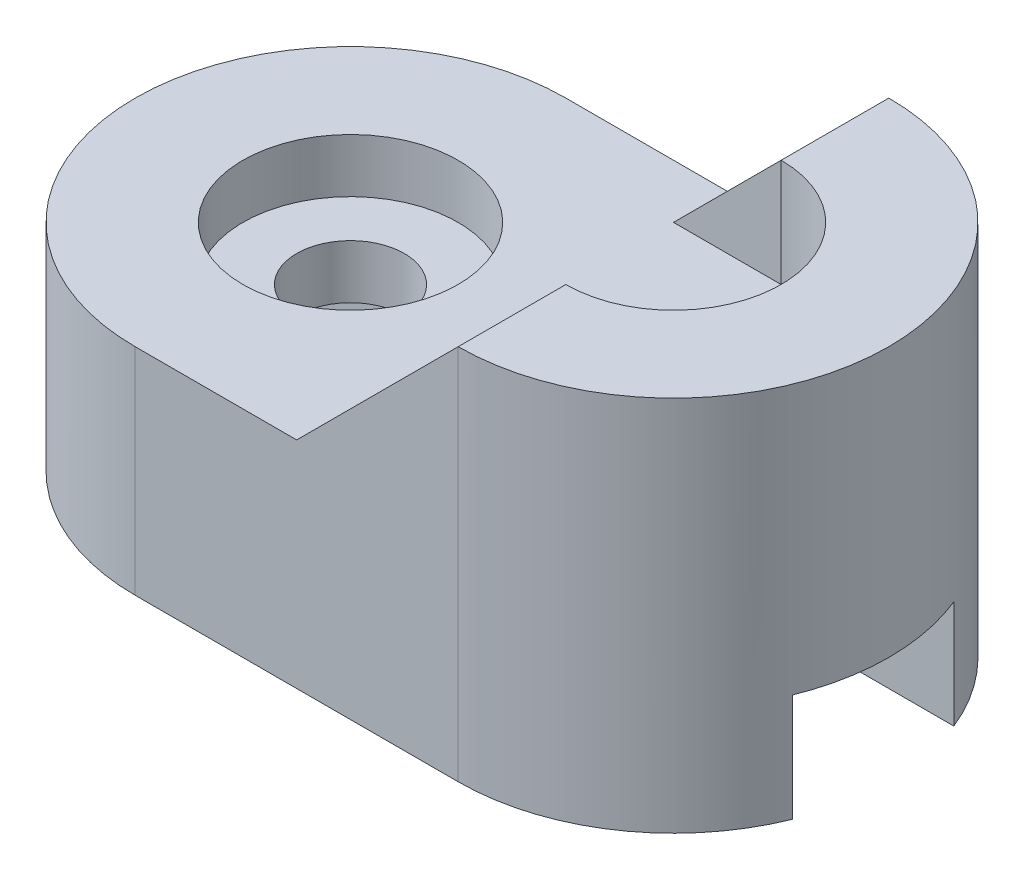
ISO-10303-21;
HEADER;
FILE_DESCRIPTION(('STEP AP214'),'2;1');
FILE_NAME('part.step','',(''),(''),'','','');
FILE_SCHEMA(('AUTOMOTIVE_DESIGN { 1 0 10303 214 1 1 1 1 }'));
ENDSEC;
DATA;
#1=APPLICATION_CONTEXT('core data for automotive mechanical design processes');
#2=APPLICATION_PROTOCOL_DEFINITION('international standard','automotive_design',2000,#1);
#3=PRODUCT_CONTEXT('',#1,'mechanical');
#4=PRODUCT('Part','Part','',(#3));
#5=PRODUCT_RELATED_PRODUCT_CATEGORY('part','',(#4));
#6=PRODUCT_DEFINITION_FORMATION('','',#4);
#7=PRODUCT_DEFINITION_CONTEXT('part definition',#1,'design');
#8=PRODUCT_DEFINITION('design','',#6,#7);
#9=PRODUCT_DEFINITION_SHAPE('','',#8);
#10=(LENGTH_UNIT() NAMED_UNIT(*) SI_UNIT(.MILLI.,.METRE.));
#11=(NAMED_UNIT(*) PLANE_ANGLE_UNIT() SI_UNIT($,.RADIAN.));
#12=(NAMED_UNIT(*) SI_UNIT($,.STERADIAN.) SOLID_ANGLE_UNIT());
#13=UNCERTAINTY_MEASURE_WITH_UNIT(LENGTH_MEASURE(1.E-05),#10,'distance_accuracy_value','');
#14=(GEOMETRIC_REPRESENTATION_CONTEXT(3) GLOBAL_UNCERTAINTY_ASSIGNED_CONTEXT((#13)) GLOBAL_UNIT_ASSIGNED_CONTEXT((#10,
#11,#12)) REPRESENTATION_CONTEXT('',''));
#15=CARTESIAN_POINT('',(0.,0.,0.));
#16=DIRECTION('',(0.,0.,1.));
#17=DIRECTION('',(1.,0.,0.));
#18=AXIS2_PLACEMENT_3D('',#15,#16,#17);
#19=CARTESIAN_POINT('',(0.,0.,0.));
#20=DIRECTION('',(0.,1.,0.));
#21=DIRECTION('',(0.,0.,1.));
#22=AXIS2_PLACEMENT_3D('',#19,#20,#21);
#23=PLANE('',#22);
#24=CARTESIAN_POINT('',(30.,0.,0.));
#25=DIRECTION('',(0.,1.,0.));
#26=DIRECTION('',(0.,0.,1.));
#27=AXIS2_PLACEMENT_3D('',#24,#25,#26);
#28=CIRCLE('',#27,40.);
#29=CARTESIAN_POINT('',(67.0809924354783,0.,-15.));
#30=VERTEX_POINT('',#29);
#31=CARTESIAN_POINT('',(30.,0.,-40.));
#32=VERTEX_POINT('',#31);
#33=EDGE_CURVE('E207',#30,#32,#28,.T.);
#34=ORIENTED_EDGE('',*,*,#33,.F.);
#35=DIRECTION('',(-1.,0.,0.));
#36=VECTOR('',#35,1.);
#37=CARTESIAN_POINT('',(0.,0.,-15.));
#38=LINE('',#37,#36);
#39=CARTESIAN_POINT('',(-67.0809924354783,0.,-15.));
#40=VERTEX_POINT('',#39);
#41=EDGE_CURVE('E56',#30,#40,#38,.T.);
#42=ORIENTED_EDGE('',*,*,#41,.T.);
#43=CARTESIAN_POINT('',(-30.,0.,0.));
#44=DIRECTION('',(0.,1.,0.));
#45=DIRECTION('',(0.,0.,1.));
#46=AXIS2_PLACEMENT_3D('',#43,#44,#45);
#47=CIRCLE('',#46,40.);
#48=CARTESIAN_POINT('',(-30.,0.,-40.));
#49=VERTEX_POINT('',#48);
#50=EDGE_CURVE('E196',#49,#40,#47,.T.);
#51=ORIENTED_EDGE('',*,*,#50,.F.);
#52=DIRECTION('',(1.,0.,0.));
#53=VECTOR('',#52,1.);
#54=CARTESIAN_POINT('',(0.,0.,-40.));
#55=LINE('',#54,#53);
#56=EDGE_CURVE('E212',#49,#32,#55,.T.);
#57=ORIENTED_EDGE('',*,*,#56,.T.);
#58=EDGE_LOOP('',(#34,#42,#51,#57));
#59=FACE_BOUND('',#58,.T.);
#60=ADVANCED_FACE('F47',(#59),#23,.F.);
#61=CARTESIAN_POINT('',(30.,70.,0.));
#62=DIRECTION('',(-1.,0.,0.));
#63=DIRECTION('',(0.,0.,1.));
#64=AXIS2_PLACEMENT_3D('',#61,#62,#63);
#65=PLANE('',#64);
#66=DIRECTION('',(0.,0.,1.));
#67=VECTOR('',#66,1.);
#68=CARTESIAN_POINT('',(30.,40.,0.));
#69=LINE('',#68,#67);
#70=CARTESIAN_POINT('',(30.,40.,20.));
#71=VERTEX_POINT('',#70);
#72=CARTESIAN_POINT('',(30.,40.,30.));
#73=VERTEX_POINT('',#72);
#74=EDGE_CURVE('E156',#71,#73,#69,.T.);
#75=ORIENTED_EDGE('',*,*,#74,.T.);
#76=DIRECTION('',(0.,1.,0.));
#77=VECTOR('',#76,1.);
#78=CARTESIAN_POINT('',(30.,70.,30.));
#79=LINE('',#78,#77);
#80=CARTESIAN_POINT('',(30.,70.,30.));
#81=VERTEX_POINT('',#80);
#82=EDGE_CURVE('E289',#73,#81,#79,.T.);
#83=ORIENTED_EDGE('',*,*,#82,.T.);
#84=DIRECTION('',(0.,0.,-1.));
#85=VECTOR('',#84,1.);
#86=CARTESIAN_POINT('',(30.,70.,0.));
#87=LINE('',#86,#85);
#88=CARTESIAN_POINT('',(30.,70.,20.));
#89=VERTEX_POINT('',#88);
#90=EDGE_CURVE('E276',#81,#89,#87,.T.);
#91=ORIENTED_EDGE('',*,*,#90,.T.);
#92=DIRECTION('',(0.,-1.,0.));
#93=VECTOR('',#92,1.);
#94=CARTESIAN_POINT('',(30.,70.,20.));
#95=LINE('',#94,#93);
#96=EDGE_CURVE('E172',#89,#71,#95,.T.);
#97=ORIENTED_EDGE('',*,*,#96,.T.);
#98=EDGE_LOOP('',(#75,#83,#91,#97));
#99=FACE_BOUND('',#98,.T.);
#100=ADVANCED_FACE('F375',(#99),#65,.T.);
#101=CARTESIAN_POINT('',(30.,70.,0.));
#102=DIRECTION('',(-1.,0.,0.));
#103=DIRECTION('',(0.,0.,1.));
#104=AXIS2_PLACEMENT_3D('',#101,#102,#103);
#105=PLANE('',#104);
#106=DIRECTION('',(0.,0.,-1.));
#107=VECTOR('',#106,1.);
#108=CARTESIAN_POINT('',(30.,70.,0.));
#109=LINE('',#108,#107);
#110=CARTESIAN_POINT('',(30.,70.,-20.));
#111=VERTEX_POINT('',#110);
#112=CARTESIAN_POINT('',(30.,70.,-30.));
#113=VERTEX_POINT('',#112);
#114=EDGE_CURVE('E180',#111,#113,#109,.T.);
#115=ORIENTED_EDGE('',*,*,#114,.T.);
#116=DIRECTION('',(0.,-1.,0.));
#117=VECTOR('',#116,1.);
#118=CARTESIAN_POINT('',(30.,70.,-30.));
#119=LINE('',#118,#117);
#120=CARTESIAN_POINT('',(30.,40.,-30.));
#121=VERTEX_POINT('',#120);
#122=EDGE_CURVE('E170',#113,#121,#119,.T.);
#123=ORIENTED_EDGE('',*,*,#122,.T.);
#124=DIRECTION('',(0.,0.,1.));
#125=VECTOR('',#124,1.);
#126=CARTESIAN_POINT('',(30.,40.,0.));
#127=LINE('',#126,#125);
#128=CARTESIAN_POINT('',(30.,40.,-20.));
#129=VERTEX_POINT('',#128);
#130=EDGE_CURVE('E153',#121,#129,#127,.T.);
#131=ORIENTED_EDGE('',*,*,#130,.T.);
#132=DIRECTION('',(0.,-1.,0.));
#133=VECTOR('',#132,1.);
#134=CARTESIAN_POINT('',(30.,70.,-20.));
#135=LINE('',#134,#133);
#136=EDGE_CURVE('E167',#111,#129,#135,.T.);
#137=ORIENTED_EDGE('',*,*,#136,.F.);
#138=EDGE_LOOP('',(#115,#123,#131,#137));
#139=FACE_BOUND('',#138,.T.);
#140=ADVANCED_FACE('F166',(#139),#105,.T.);
#141=CARTESIAN_POINT('',(0.,40.,40.));
#142=DIRECTION('',(0.,0.,-1.));
#143=DIRECTION('',(-1.,0.,0.));
#144=AXIS2_PLACEMENT_3D('',#141,#142,#143);
#145=PLANE('',#144);
#146=DIRECTION('',(1.,0.,0.));
#147=VECTOR('',#146,1.);
#148=CARTESIAN_POINT('',(0.,0.,40.));
#149=LINE('',#148,#147);
#150=CARTESIAN_POINT('',(-30.,0.,40.));
#151=VERTEX_POINT('',#150);
#152=CARTESIAN_POINT('',(30.,0.,40.));
#153=VERTEX_POINT('',#152);
#154=EDGE_CURVE('E191',#151,#153,#149,.T.);
#155=ORIENTED_EDGE('',*,*,#154,.T.);
#156=DIRECTION('',(0.,-1.,0.));
#157=VECTOR('',#156,1.);
#158=CARTESIAN_POINT('',(30.,40.,40.));
#159=LINE('',#158,#157);
#160=CARTESIAN_POINT('',(30.,70.,40.));
#161=VERTEX_POINT('',#160);
#162=EDGE_CURVE('E230',#161,#153,#159,.T.);
#163=ORIENTED_EDGE('',*,*,#162,.F.);
#164=DIRECTION('',(-0.707106781186547,-0.707106781186548,0.));
#165=VECTOR('',#164,1.);
#166=CARTESIAN_POINT('',(30.,70.,40.));
#167=LINE('',#166,#165);
#168=CARTESIAN_POINT('',(0.,40.,40.));
#169=VERTEX_POINT('',#168);
#170=EDGE_CURVE('E299',#161,#169,#167,.T.);
#171=ORIENTED_EDGE('',*,*,#170,.T.);
#172=DIRECTION('',(1.,0.,0.));
#173=VECTOR('',#172,1.);
#174=CARTESIAN_POINT('',(0.,40.,40.));
#175=LINE('',#174,#173);
#176=CARTESIAN_POINT('',(-30.,40.,40.));
#177=VERTEX_POINT('',#176);
#178=EDGE_CURVE('E192',#177,#169,#175,.T.);
#179=ORIENTED_EDGE('',*,*,#178,.F.);
#180=DIRECTION('',(0.,-1.,0.));
#181=VECTOR('',#180,1.);
#182=CARTESIAN_POINT('',(-30.,40.,40.));
#183=LINE('',#182,#181);
#184=EDGE_CURVE('E203',#177,#151,#183,.T.);
#185=ORIENTED_EDGE('',*,*,#184,.T.);
#186=EDGE_LOOP('',(#155,#163,#171,#179,#185));
#187=FACE_BOUND('',#186,.T.);
#188=ADVANCED_FACE('F49',(#187),#145,.F.);
#189=CARTESIAN_POINT('',(30.,40.,0.));
#190=DIRECTION('',(0.,-1.,0.));
#191=DIRECTION('',(0.,0.,-1.));
#192=AXIS2_PLACEMENT_3D('',#189,#190,#191);
#193=CYLINDRICAL_SURFACE('',#192,40.);
#194=CARTESIAN_POINT('',(67.0809924354783,0.,15.));
#195=VERTEX_POINT('',#194);
#196=EDGE_CURVE('E208',#153,#195,#28,.T.);
#197=ORIENTED_EDGE('',*,*,#196,.T.);
#198=DIRECTION('',(0.,-1.,0.));
#199=VECTOR('',#198,1.);
#200=CARTESIAN_POINT('',(67.0809924354783,40.,15.));
#201=LINE('',#200,#199);
#202=CARTESIAN_POINT('',(67.0809924354783,20.,15.));
#203=VERTEX_POINT('',#202);
#204=EDGE_CURVE('E63',#195,#203,#201,.F.);
#205=ORIENTED_EDGE('',*,*,#204,.T.);
#206=CARTESIAN_POINT('',(30.,20.,0.));
#207=DIRECTION('',(0.,1.,0.));
#208=DIRECTION('',(0.,0.,1.));
#209=AXIS2_PLACEMENT_3D('',#206,#207,#208);
#210=CIRCLE('',#209,40.);
#211=CARTESIAN_POINT('',(67.0809924354783,20.,-15.));
#212=VERTEX_POINT('',#211);
#213=EDGE_CURVE('E306',#203,#212,#210,.T.);
#214=ORIENTED_EDGE('',*,*,#213,.T.);
#215=DIRECTION('',(0.,-1.,0.));
#216=VECTOR('',#215,1.);
#217=CARTESIAN_POINT('',(67.0809924354783,40.,-15.));
#218=LINE('',#217,#216);
#219=EDGE_CURVE('E312',#212,#30,#218,.T.);
#220=ORIENTED_EDGE('',*,*,#219,.T.);
#221=ORIENTED_EDGE('',*,*,#33,.T.);
#222=DIRECTION('',(0.,-1.,0.));
#223=VECTOR('',#222,1.);
#224=CARTESIAN_POINT('',(30.,40.,-40.));
#225=LINE('',#224,#223);
#226=CARTESIAN_POINT('',(30.,70.,-40.));
#227=VERTEX_POINT('',#226);
#228=EDGE_CURVE('E226',#227,#32,#225,.T.);
#229=ORIENTED_EDGE('',*,*,#228,.F.);
#230=CARTESIAN_POINT('',(30.,70.,0.));
#231=DIRECTION('',(0.,1.,0.));
#232=DIRECTION('',(0.,0.,1.));
#233=AXIS2_PLACEMENT_3D('',#230,#231,#232);
#234=CIRCLE('',#233,40.);
#235=EDGE_CURVE('E262',#161,#227,#234,.T.);
#236=ORIENTED_EDGE('',*,*,#235,.F.);
#237=ORIENTED_EDGE('',*,*,#162,.T.);
#238=EDGE_LOOP('',(#197,#205,#214,#220,#221,#229,#236,#237));
#239=FACE_BOUND('',#238,.T.);
#240=ADVANCED_FACE('F261',(#239),#193,.T.);
#241=CARTESIAN_POINT('',(0.,40.,-40.));
#242=DIRECTION('',(0.,0.,-1.));
#243=DIRECTION('',(-1.,0.,0.));
#244=AXIS2_PLACEMENT_3D('',#241,#242,#243);
#245=PLANE('',#244);
#246=ORIENTED_EDGE('',*,*,#56,.F.);
#247=DIRECTION('',(0.,-1.,0.));
#248=VECTOR('',#247,1.);
#249=CARTESIAN_POINT('',(-30.,40.,-40.));
#250=LINE('',#249,#248);
#251=CARTESIAN_POINT('',(-30.,40.,-40.));
#252=VERTEX_POINT('',#251);
#253=EDGE_CURVE('E223',#252,#49,#250,.T.);
#254=ORIENTED_EDGE('',*,*,#253,.F.);
#255=DIRECTION('',(1.,0.,0.));
#256=VECTOR('',#255,1.);
#257=CARTESIAN_POINT('',(0.,40.,-40.));
#258=LINE('',#257,#256);
#259=CARTESIAN_POINT('',(0.,40.,-40.));
#260=VERTEX_POINT('',#259);
#261=EDGE_CURVE('E195',#252,#260,#258,.T.);
#262=ORIENTED_EDGE('',*,*,#261,.T.);
#263=DIRECTION('',(-0.707106781186547,-0.707106781186548,0.));
#264=VECTOR('',#263,1.);
#265=CARTESIAN_POINT('',(30.,70.,-40.));
#266=LINE('',#265,#264);
#267=EDGE_CURVE('E257',#227,#260,#266,.T.);
#268=ORIENTED_EDGE('',*,*,#267,.F.);
#269=ORIENTED_EDGE('',*,*,#228,.T.);
#270=EDGE_LOOP('',(#246,#254,#262,#268,#269));
#271=FACE_BOUND('',#270,.T.);
#272=ADVANCED_FACE('F253',(#271),#245,.T.);
#273=CARTESIAN_POINT('',(-30.,40.,0.));
#274=DIRECTION('',(0.,-1.,0.));
#275=DIRECTION('',(0.,0.,-1.));
#276=AXIS2_PLACEMENT_3D('',#273,#274,#275);
#277=CYLINDRICAL_SURFACE('',#276,40.);
#278=ORIENTED_EDGE('',*,*,#50,.T.);
#279=DIRECTION('',(0.,-1.,0.));
#280=VECTOR('',#279,1.);
#281=CARTESIAN_POINT('',(-67.0809924354783,40.,-15.));
#282=LINE('',#281,#280);
#283=CARTESIAN_POINT('',(-67.0809924354783,20.,-15.));
#284=VERTEX_POINT('',#283);
#285=EDGE_CURVE('E248',#40,#284,#282,.F.);
#286=ORIENTED_EDGE('',*,*,#285,.T.);
#287=CARTESIAN_POINT('',(-30.,20.,0.));
#288=DIRECTION('',(0.,1.,0.));
#289=DIRECTION('',(0.,0.,1.));
#290=AXIS2_PLACEMENT_3D('',#287,#288,#289);
#291=CIRCLE('',#290,40.);
#292=CARTESIAN_POINT('',(-67.0809924354783,20.,15.));
#293=VERTEX_POINT('',#292);
#294=EDGE_CURVE('E11',#284,#293,#291,.T.);
#295=ORIENTED_EDGE('',*,*,#294,.T.);
#296=DIRECTION('',(0.,-1.,0.));
#297=VECTOR('',#296,1.);
#298=CARTESIAN_POINT('',(-67.0809924354783,40.,15.));
#299=LINE('',#298,#297);
#300=CARTESIAN_POINT('',(-67.0809924354783,0.,15.));
#301=VERTEX_POINT('',#300);
#302=EDGE_CURVE('E319',#293,#301,#299,.T.);
#303=ORIENTED_EDGE('',*,*,#302,.T.);
#304=EDGE_CURVE('E216',#301,#151,#47,.T.);
#305=ORIENTED_EDGE('',*,*,#304,.T.);
#306=ORIENTED_EDGE('',*,*,#184,.F.);
#307=CARTESIAN_POINT('',(-30.,40.,0.));
#308=DIRECTION('',(0.,1.,0.));
#309=DIRECTION('',(0.,0.,1.));
#310=AXIS2_PLACEMENT_3D('',#307,#308,#309);
#311=CIRCLE('',#310,40.);
#312=EDGE_CURVE('E200',#252,#177,#311,.T.);
#313=ORIENTED_EDGE('',*,*,#312,.F.);
#314=ORIENTED_EDGE('',*,*,#253,.T.);
#315=EDGE_LOOP('',(#278,#286,#295,#303,#305,#306,#313,#314));
#316=FACE_BOUND('',#315,.T.);
#317=ADVANCED_FACE('F247',(#316),#277,.T.);
#318=CARTESIAN_POINT('',(0.,40.,0.));
#319=DIRECTION('',(0.,1.,0.));
#320=DIRECTION('',(0.,0.,1.));
#321=AXIS2_PLACEMENT_3D('',#318,#319,#320);
#322=PLANE('',#321);
#323=CARTESIAN_POINT('',(30.,40.,0.));
#324=DIRECTION('',(0.,1.,0.));
#325=DIRECTION('',(0.,0.,1.));
#326=AXIS2_PLACEMENT_3D('',#323,#324,#325);
#327=CIRCLE('',#326,20.);
#328=EDGE_CURVE('E149',#129,#71,#327,.T.);
#329=ORIENTED_EDGE('',*,*,#328,.F.);
#330=ORIENTED_EDGE('',*,*,#130,.F.);
#331=DIRECTION('',(-1.,0.,0.));
#332=VECTOR('',#331,1.);
#333=CARTESIAN_POINT('',(0.,40.,-30.));
#334=LINE('',#333,#332);
#335=CARTESIAN_POINT('',(0.,40.,-30.));
#336=VERTEX_POINT('',#335);
#337=EDGE_CURVE('E286',#336,#121,#334,.F.);
#338=ORIENTED_EDGE('',*,*,#337,.F.);
#339=DIRECTION('',(0.,0.,-1.));
#340=VECTOR('',#339,1.);
#341=CARTESIAN_POINT('',(0.,40.,-40.));
#342=LINE('',#341,#340);
#343=EDGE_CURVE('E283',#336,#260,#342,.T.);
#344=ORIENTED_EDGE('',*,*,#343,.T.);
#345=ORIENTED_EDGE('',*,*,#261,.F.);
#346=ORIENTED_EDGE('',*,*,#312,.T.);
#347=ORIENTED_EDGE('',*,*,#178,.T.);
#348=DIRECTION('',(0.,0.,1.));
#349=VECTOR('',#348,1.);
#350=CARTESIAN_POINT('',(0.,40.,40.));
#351=LINE('',#350,#349);
#352=CARTESIAN_POINT('',(0.,40.,30.));
#353=VERTEX_POINT('',#352);
#354=EDGE_CURVE('E71',#353,#169,#351,.T.);
#355=ORIENTED_EDGE('',*,*,#354,.F.);
#356=DIRECTION('',(1.,0.,0.));
#357=VECTOR('',#356,1.);
#358=CARTESIAN_POINT('',(0.,40.,30.));
#359=LINE('',#358,#357);
#360=EDGE_CURVE('E303',#353,#73,#359,.T.);
#361=ORIENTED_EDGE('',*,*,#360,.T.);
#362=ORIENTED_EDGE('',*,*,#74,.F.);
#363=EDGE_LOOP('',(#329,#330,#338,#344,#345,#346,#347,#355,#361,#362));
#364=FACE_BOUND('',#363,.T.);
#365=CARTESIAN_POINT('',(-30.,40.,0.));
#366=DIRECTION('',(0.,1.,0.));
#367=DIRECTION('',(0.,0.,1.));
#368=AXIS2_PLACEMENT_3D('',#365,#366,#367);
#369=CIRCLE('',#368,20.);
#370=CARTESIAN_POINT('',(-30.,40.,20.));
#371=VERTEX_POINT('',#370);
#372=EDGE_CURVE('E342',#371,#371,#369,.T.);
#373=ORIENTED_EDGE('',*,*,#372,.F.);
#374=EDGE_LOOP('',(#373));
#375=FACE_BOUND('',#374,.T.);
#376=ADVANCED_FACE('F151',(#364,#375),#322,.T.);
#377=ORIENTED_EDGE('',*,*,#304,.F.);
#378=DIRECTION('',(1.,0.,0.));
#379=VECTOR('',#378,1.);
#380=CARTESIAN_POINT('',(0.,0.,15.));
#381=LINE('',#380,#379);
#382=EDGE_CURVE('E234',#301,#195,#381,.T.);
#383=ORIENTED_EDGE('',*,*,#382,.T.);
#384=ORIENTED_EDGE('',*,*,#196,.F.);
#385=ORIENTED_EDGE('',*,*,#154,.F.);
#386=EDGE_LOOP('',(#377,#383,#384,#385));
#387=FACE_BOUND('',#386,.T.);
#388=ADVANCED_FACE('F361',(#387),#23,.F.);
#389=CARTESIAN_POINT('',(30.,70.,0.));
#390=DIRECTION('',(0.,-1.,0.));
#391=DIRECTION('',(0.,0.,-1.));
#392=AXIS2_PLACEMENT_3D('',#389,#390,#391);
#393=CYLINDRICAL_SURFACE('',#392,20.);
#394=ORIENTED_EDGE('',*,*,#136,.T.);
#395=ORIENTED_EDGE('',*,*,#328,.T.);
#396=ORIENTED_EDGE('',*,*,#96,.F.);
#397=CARTESIAN_POINT('',(30.,70.,0.));
#398=DIRECTION('',(0.,1.,0.));
#399=DIRECTION('',(0.,0.,1.));
#400=AXIS2_PLACEMENT_3D('',#397,#398,#399);
#401=CIRCLE('',#400,20.);
#402=EDGE_CURVE('E177',#89,#111,#401,.T.);
#403=ORIENTED_EDGE('',*,*,#402,.T.);
#404=EDGE_LOOP('',(#394,#395,#396,#403));
#405=FACE_BOUND('',#404,.T.);
#406=CARTESIAN_POINT('',(30.,30.,0.));
#407=DIRECTION('',(0.,1.,0.));
#408=DIRECTION('',(0.,0.,1.));
#409=AXIS2_PLACEMENT_3D('',#406,#407,#408);
#410=CIRCLE('',#409,20.);
#411=CARTESIAN_POINT('',(30.,30.,20.));
#412=VERTEX_POINT('',#411);
#413=EDGE_CURVE('E162',#412,#412,#410,.T.);
#414=ORIENTED_EDGE('',*,*,#413,.F.);
#415=EDGE_LOOP('',(#414));
#416=FACE_BOUND('',#415,.T.);
#417=ADVANCED_FACE('F174',(#405,#416),#393,.F.);
#418=CARTESIAN_POINT('',(0.,70.,0.));
#419=DIRECTION('',(0.,1.,0.));
#420=DIRECTION('',(0.,0.,1.));
#421=AXIS2_PLACEMENT_3D('',#418,#419,#420);
#422=PLANE('',#421);
#423=ORIENTED_EDGE('',*,*,#235,.T.);
#424=EDGE_CURVE('E185',#113,#227,#109,.T.);
#425=ORIENTED_EDGE('',*,*,#424,.F.);
#426=ORIENTED_EDGE('',*,*,#114,.F.);
#427=ORIENTED_EDGE('',*,*,#402,.F.);
#428=ORIENTED_EDGE('',*,*,#90,.F.);
#429=EDGE_CURVE('E273',#161,#81,#87,.T.);
#430=ORIENTED_EDGE('',*,*,#429,.F.);
#431=EDGE_LOOP('',(#423,#425,#426,#427,#428,#430));
#432=FACE_BOUND('',#431,.T.);
#433=ADVANCED_FACE('F360',(#432),#422,.T.);
#434=CARTESIAN_POINT('',(30.,70.,-40.));
#435=DIRECTION('',(0.707106781186548,-0.707106781186547,0.));
#436=DIRECTION('',(-0.707106781186547,-0.707106781186548,0.));
#437=AXIS2_PLACEMENT_3D('',#434,#435,#436);
#438=PLANE('',#437);
#439=ORIENTED_EDGE('',*,*,#424,.T.);
#440=ORIENTED_EDGE('',*,*,#267,.T.);
#441=ORIENTED_EDGE('',*,*,#343,.F.);
#442=DIRECTION('',(-0.707106781186547,-0.707106781186548,0.));
#443=VECTOR('',#442,1.);
#444=CARTESIAN_POINT('',(30.,70.,-30.));
#445=LINE('',#444,#443);
#446=EDGE_CURVE('E269',#113,#336,#445,.T.);
#447=ORIENTED_EDGE('',*,*,#446,.F.);
#448=EDGE_LOOP('',(#439,#440,#441,#447));
#449=FACE_BOUND('',#448,.T.);
#450=ADVANCED_FACE('F266',(#449),#438,.F.);
#451=CARTESIAN_POINT('',(0.,35.,-30.));
#452=DIRECTION('',(0.,0.,-1.));
#453=DIRECTION('',(-1.,0.,0.));
#454=AXIS2_PLACEMENT_3D('',#451,#452,#453);
#455=PLANE('',#454);
#456=ORIENTED_EDGE('',*,*,#122,.F.);
#457=ORIENTED_EDGE('',*,*,#446,.T.);
#458=ORIENTED_EDGE('',*,*,#337,.T.);
#459=EDGE_LOOP('',(#456,#457,#458));
#460=FACE_BOUND('',#459,.T.);
#461=ADVANCED_FACE('F425',(#460),#455,.F.);
#462=CARTESIAN_POINT('',(30.,70.,40.));
#463=DIRECTION('',(-0.707106781186548,0.707106781186547,0.));
#464=DIRECTION('',(-0.707106781186547,-0.707106781186548,0.));
#465=AXIS2_PLACEMENT_3D('',#462,#463,#464);
#466=PLANE('',#465);
#467=ORIENTED_EDGE('',*,*,#429,.T.);
#468=DIRECTION('',(-0.707106781186547,-0.707106781186548,0.));
#469=VECTOR('',#468,1.);
#470=CARTESIAN_POINT('',(30.,70.,30.));
#471=LINE('',#470,#469);
#472=EDGE_CURVE('E300',#81,#353,#471,.T.);
#473=ORIENTED_EDGE('',*,*,#472,.T.);
#474=ORIENTED_EDGE('',*,*,#354,.T.);
#475=ORIENTED_EDGE('',*,*,#170,.F.);
#476=EDGE_LOOP('',(#467,#473,#474,#475));
#477=FACE_BOUND('',#476,.T.);
#478=ADVANCED_FACE('F421',(#477),#466,.T.);
#479=CARTESIAN_POINT('',(0.,35.,30.));
#480=DIRECTION('',(0.,0.,1.));
#481=DIRECTION('',(1.,0.,0.));
#482=AXIS2_PLACEMENT_3D('',#479,#480,#481);
#483=PLANE('',#482);
#484=ORIENTED_EDGE('',*,*,#82,.F.);
#485=ORIENTED_EDGE('',*,*,#360,.F.);
#486=ORIENTED_EDGE('',*,*,#472,.F.);
#487=EDGE_LOOP('',(#484,#485,#486));
#488=FACE_BOUND('',#487,.T.);
#489=ADVANCED_FACE('F417',(#488),#483,.F.);
#490=CARTESIAN_POINT('',(-70.,20.,15.));
#491=DIRECTION('',(0.,1.,0.));
#492=DIRECTION('',(0.,0.,1.));
#493=AXIS2_PLACEMENT_3D('',#490,#491,#492);
#494=PLANE('',#493);
#495=CARTESIAN_POINT('',(30.,20.,0.));
#496=DIRECTION('',(0.,1.,0.));
#497=DIRECTION('',(0.,0.,1.));
#498=AXIS2_PLACEMENT_3D('',#495,#496,#497);
#499=CIRCLE('',#498,9.99999999999999);
#500=CARTESIAN_POINT('',(30.,20.,9.99999999999999));
#501=VERTEX_POINT('',#500);
#502=EDGE_CURVE('E346',#501,#501,#499,.T.);
#503=ORIENTED_EDGE('',*,*,#502,.T.);
#504=EDGE_LOOP('',(#503));
#505=FACE_BOUND('',#504,.T.);
#506=CARTESIAN_POINT('',(-30.,20.,0.));
#507=DIRECTION('',(0.,1.,0.));
#508=DIRECTION('',(0.,0.,1.));
#509=AXIS2_PLACEMENT_3D('',#506,#507,#508);
#510=CIRCLE('',#509,9.99999999999999);
#511=CARTESIAN_POINT('',(-30.,20.,9.99999999999999));
#512=VERTEX_POINT('',#511);
#513=EDGE_CURVE('E328',#512,#512,#510,.T.);
#514=ORIENTED_EDGE('',*,*,#513,.T.);
#515=EDGE_LOOP('',(#514));
#516=FACE_BOUND('',#515,.T.);
#517=DIRECTION('',(1.,0.,0.));
#518=VECTOR('',#517,1.);
#519=CARTESIAN_POINT('',(-70.,20.,15.));
#520=LINE('',#519,#518);
#521=EDGE_CURVE('E323',#293,#203,#520,.T.);
#522=ORIENTED_EDGE('',*,*,#521,.F.);
#523=ORIENTED_EDGE('',*,*,#294,.F.);
#524=DIRECTION('',(1.,0.,0.));
#525=VECTOR('',#524,1.);
#526=CARTESIAN_POINT('',(-70.,20.,-15.));
#527=LINE('',#526,#525);
#528=EDGE_CURVE('E324',#284,#212,#527,.T.);
#529=ORIENTED_EDGE('',*,*,#528,.T.);
#530=ORIENTED_EDGE('',*,*,#213,.F.);
#531=EDGE_LOOP('',(#522,#523,#529,#530));
#532=FACE_BOUND('',#531,.T.);
#533=ADVANCED_FACE('F402',(#505,#516,#532),#494,.F.);
#534=CARTESIAN_POINT('',(-70.,20.,-15.));
#535=DIRECTION('',(0.,0.,-1.));
#536=DIRECTION('',(0.,1.,0.));
#537=AXIS2_PLACEMENT_3D('',#534,#535,#536);
#538=PLANE('',#537);
#539=ORIENTED_EDGE('',*,*,#528,.F.);
#540=ORIENTED_EDGE('',*,*,#285,.F.);
#541=ORIENTED_EDGE('',*,*,#41,.F.);
#542=ORIENTED_EDGE('',*,*,#219,.F.);
#543=EDGE_LOOP('',(#539,#540,#541,#542));
#544=FACE_BOUND('',#543,.T.);
#545=ADVANCED_FACE('F401',(#544),#538,.F.);
#546=CARTESIAN_POINT('',(-70.,20.,15.));
#547=DIRECTION('',(0.,0.,1.));
#548=DIRECTION('',(0.,-1.,0.));
#549=AXIS2_PLACEMENT_3D('',#546,#547,#548);
#550=PLANE('',#549);
#551=ORIENTED_EDGE('',*,*,#382,.F.);
#552=ORIENTED_EDGE('',*,*,#302,.F.);
#553=ORIENTED_EDGE('',*,*,#521,.T.);
#554=ORIENTED_EDGE('',*,*,#204,.F.);
#555=EDGE_LOOP('',(#551,#552,#553,#554));
#556=FACE_BOUND('',#555,.T.);
#557=ADVANCED_FACE('F403',(#556),#550,.F.);
#558=CARTESIAN_POINT('',(-30.,40.,0.));
#559=DIRECTION('',(0.,1.,0.));
#560=DIRECTION('',(0.,0.,1.));
#561=AXIS2_PLACEMENT_3D('',#558,#559,#560);
#562=CYLINDRICAL_SURFACE('',#561,10.);
#563=ORIENTED_EDGE('',*,*,#513,.F.);
#564=EDGE_LOOP('',(#563));
#565=FACE_BOUND('',#564,.T.);
#566=CARTESIAN_POINT('',(-30.,30.,0.));
#567=DIRECTION('',(0.,1.,0.));
#568=DIRECTION('',(0.,0.,1.));
#569=AXIS2_PLACEMENT_3D('',#566,#567,#568);
#570=CIRCLE('',#569,10.);
#571=CARTESIAN_POINT('',(-30.,30.,10.));
#572=VERTEX_POINT('',#571);
#573=EDGE_CURVE('E334',#572,#572,#570,.T.);
#574=ORIENTED_EDGE('',*,*,#573,.T.);
#575=EDGE_LOOP('',(#574));
#576=FACE_BOUND('',#575,.T.);
#577=ADVANCED_FACE('F405',(#565,#576),#562,.F.);
#578=CARTESIAN_POINT('',(-20.,30.,0.));
#579=DIRECTION('',(0.,-1.,0.));
#580=DIRECTION('',(0.,0.,-1.));
#581=AXIS2_PLACEMENT_3D('',#578,#579,#580);
#582=PLANE('',#581);
#583=ORIENTED_EDGE('',*,*,#573,.F.);
#584=EDGE_LOOP('',(#583));
#585=FACE_BOUND('',#584,.T.);
#586=CARTESIAN_POINT('',(-30.,30.,0.));
#587=DIRECTION('',(0.,1.,0.));
#588=DIRECTION('',(0.,0.,1.));
#589=AXIS2_PLACEMENT_3D('',#586,#587,#588);
#590=CIRCLE('',#589,20.);
#591=CARTESIAN_POINT('',(-30.,30.,20.));
#592=VERTEX_POINT('',#591);
#593=EDGE_CURVE('E338',#592,#592,#590,.T.);
#594=ORIENTED_EDGE('',*,*,#593,.T.);
#595=EDGE_LOOP('',(#594));
#596=FACE_BOUND('',#595,.T.);
#597=ADVANCED_FACE('F411',(#585,#596),#582,.F.);
#598=CARTESIAN_POINT('',(-30.,40.,0.));
#599=DIRECTION('',(0.,1.,0.));
#600=DIRECTION('',(0.,0.,1.));
#601=AXIS2_PLACEMENT_3D('',#598,#599,#600);
#602=CYLINDRICAL_SURFACE('',#601,20.);
#603=ORIENTED_EDGE('',*,*,#593,.F.);
#604=EDGE_LOOP('',(#603));
#605=FACE_BOUND('',#604,.T.);
#606=ORIENTED_EDGE('',*,*,#372,.T.);
#607=EDGE_LOOP('',(#606));
#608=FACE_BOUND('',#607,.T.);
#609=ADVANCED_FACE('F509',(#605,#608),#602,.F.);
#610=CARTESIAN_POINT('',(30.,40.,0.));
#611=DIRECTION('',(0.,1.,0.));
#612=DIRECTION('',(0.,0.,1.));
#613=AXIS2_PLACEMENT_3D('',#610,#611,#612);
#614=CYLINDRICAL_SURFACE('',#613,9.99999999999999);
#615=ORIENTED_EDGE('',*,*,#502,.F.);
#616=EDGE_LOOP('',(#615));
#617=FACE_BOUND('',#616,.T.);
#618=CARTESIAN_POINT('',(30.,30.,0.));
#619=DIRECTION('',(0.,1.,0.));
#620=DIRECTION('',(0.,0.,1.));
#621=AXIS2_PLACEMENT_3D('',#618,#619,#620);
#622=CIRCLE('',#621,9.99999999999999);
#623=CARTESIAN_POINT('',(30.,30.,9.99999999999999));
#624=VERTEX_POINT('',#623);
#625=EDGE_CURVE('E350',#624,#624,#622,.T.);
#626=ORIENTED_EDGE('',*,*,#625,.T.);
#627=EDGE_LOOP('',(#626));
#628=FACE_BOUND('',#627,.T.);
#629=ADVANCED_FACE('F518',(#617,#628),#614,.F.);
#630=CARTESIAN_POINT('',(40.,30.,0.));
#631=DIRECTION('',(0.,-1.,0.));
#632=DIRECTION('',(0.,0.,-1.));
#633=AXIS2_PLACEMENT_3D('',#630,#631,#632);
#634=PLANE('',#633);
#635=ORIENTED_EDGE('',*,*,#625,.F.);
#636=EDGE_LOOP('',(#635));
#637=FACE_BOUND('',#636,.T.);
#638=ORIENTED_EDGE('',*,*,#413,.T.);
#639=EDGE_LOOP('',(#638));
#640=FACE_BOUND('',#639,.T.);
#641=ADVANCED_FACE('F358',(#637,#640),#634,.F.);
#642=CLOSED_SHELL('',(#60,#100,#140,#188,#240,#272,#317,#376,#388,#417,#433,#450,#461,#478,#489,
#533,#545,#557,#577,#597,#609,#629,#641));
#643=MANIFOLD_SOLID_BREP('B2',#642);
#644=ADVANCED_BREP_SHAPE_REPRESENTATION('',(#18,#643),#14);
#645=SHAPE_DEFINITION_REPRESENTATION(#9,#644);
ENDSEC;
END-ISO-10303-21;
